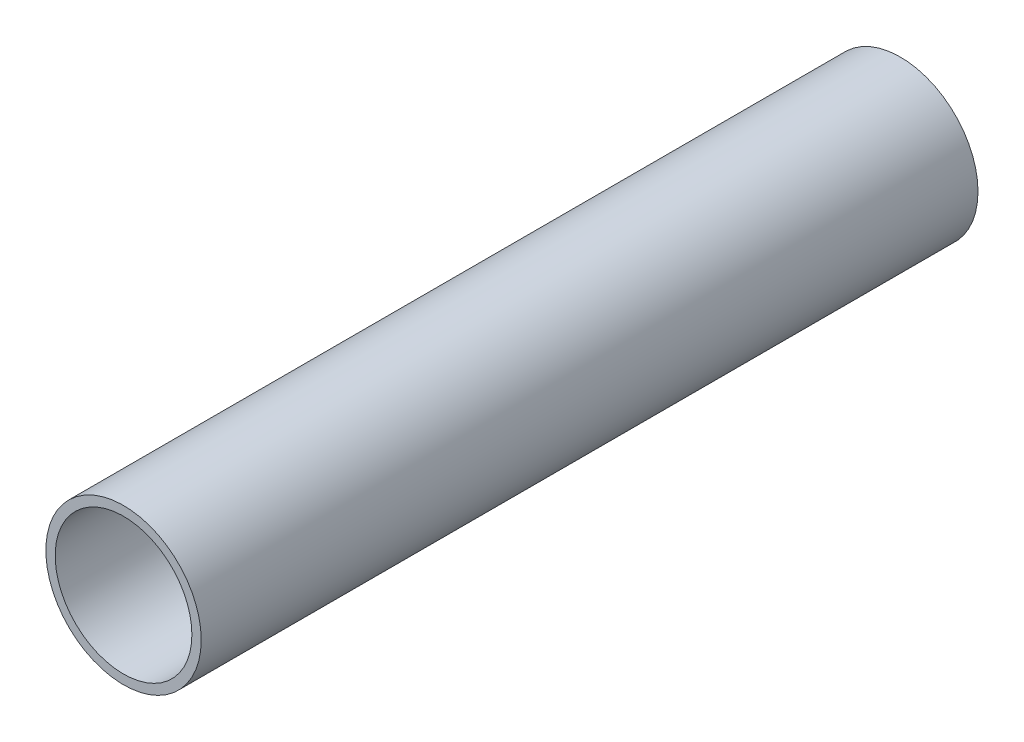
ISO-10303-21;
HEADER;
FILE_DESCRIPTION(('STEP AP214'),'2;1');
FILE_NAME('part.step','',(''),(''),'','','');
FILE_SCHEMA(('AUTOMOTIVE_DESIGN { 1 0 10303 214 1 1 1 1 }'));
ENDSEC;
DATA;
#1=APPLICATION_CONTEXT('core data for automotive mechanical design processes');
#2=APPLICATION_PROTOCOL_DEFINITION('international standard','automotive_design',2000,#1);
#3=PRODUCT_CONTEXT('',#1,'mechanical');
#4=PRODUCT('Part','Part','',(#3));
#5=PRODUCT_RELATED_PRODUCT_CATEGORY('part','',(#4));
#6=PRODUCT_DEFINITION_FORMATION('','',#4);
#7=PRODUCT_DEFINITION_CONTEXT('part definition',#1,'design');
#8=PRODUCT_DEFINITION('design','',#6,#7);
#9=PRODUCT_DEFINITION_SHAPE('','',#8);
#10=(LENGTH_UNIT() NAMED_UNIT(*) SI_UNIT(.MILLI.,.METRE.));
#11=(NAMED_UNIT(*) PLANE_ANGLE_UNIT() SI_UNIT($,.RADIAN.));
#12=(NAMED_UNIT(*) SI_UNIT($,.STERADIAN.) SOLID_ANGLE_UNIT());
#13=UNCERTAINTY_MEASURE_WITH_UNIT(LENGTH_MEASURE(1.E-05),#10,'distance_accuracy_value','');
#14=(GEOMETRIC_REPRESENTATION_CONTEXT(3) GLOBAL_UNCERTAINTY_ASSIGNED_CONTEXT((#13)) GLOBAL_UNIT_ASSIGNED_CONTEXT((#10,
#11,#12)) REPRESENTATION_CONTEXT('',''));
#15=CARTESIAN_POINT('',(0.,0.,0.));
#16=DIRECTION('',(0.,0.,1.));
#17=DIRECTION('',(1.,0.,0.));
#18=AXIS2_PLACEMENT_3D('',#15,#16,#17);
#19=CARTESIAN_POINT('',(0.,0.,25.));
#20=DIRECTION('',(0.,0.,1.));
#21=DIRECTION('',(1.,0.,0.));
#22=AXIS2_PLACEMENT_3D('',#19,#20,#21);
#23=PLANE('',#22);
#24=CARTESIAN_POINT('',(0.,0.,25.));
#25=DIRECTION('',(0.,0.,1.));
#26=DIRECTION('',(1.,0.,0.));
#27=AXIS2_PLACEMENT_3D('',#24,#25,#26);
#28=CIRCLE('',#27,2.5);
#29=CARTESIAN_POINT('',(2.5,0.,25.));
#30=VERTEX_POINT('',#29);
#31=EDGE_CURVE('E10',#30,#30,#28,.T.);
#32=ORIENTED_EDGE('',*,*,#31,.T.);
#33=EDGE_LOOP('',(#32));
#34=FACE_BOUND('',#33,.T.);
#35=CARTESIAN_POINT('',(0.,0.,25.));
#36=DIRECTION('',(0.,0.,1.));
#37=DIRECTION('',(1.,0.,0.));
#38=AXIS2_PLACEMENT_3D('',#35,#36,#37);
#39=CIRCLE('',#38,2.2);
#40=CARTESIAN_POINT('',(2.2,0.,25.));
#41=VERTEX_POINT('',#40);
#42=EDGE_CURVE('E42',#41,#41,#39,.T.);
#43=ORIENTED_EDGE('',*,*,#42,.F.);
#44=EDGE_LOOP('',(#43));
#45=FACE_BOUND('',#44,.T.);
#46=ADVANCED_FACE('F31',(#34,#45),#23,.T.);
#47=CARTESIAN_POINT('',(0.,0.,0.));
#48=DIRECTION('',(0.,0.,1.));
#49=DIRECTION('',(1.,0.,0.));
#50=AXIS2_PLACEMENT_3D('',#47,#48,#49);
#51=PLANE('',#50);
#52=CARTESIAN_POINT('',(0.,0.,0.));
#53=DIRECTION('',(0.,0.,1.));
#54=DIRECTION('',(1.,0.,0.));
#55=AXIS2_PLACEMENT_3D('',#52,#53,#54);
#56=CIRCLE('',#55,2.5);
#57=CARTESIAN_POINT('',(2.5,0.,0.));
#58=VERTEX_POINT('',#57);
#59=EDGE_CURVE('E35',#58,#58,#56,.T.);
#60=ORIENTED_EDGE('',*,*,#59,.F.);
#61=EDGE_LOOP('',(#60));
#62=FACE_BOUND('',#61,.T.);
#63=CARTESIAN_POINT('',(0.,0.,0.));
#64=DIRECTION('',(0.,0.,1.));
#65=DIRECTION('',(1.,0.,0.));
#66=AXIS2_PLACEMENT_3D('',#63,#64,#65);
#67=CIRCLE('',#66,2.2);
#68=CARTESIAN_POINT('',(2.2,0.,0.));
#69=VERTEX_POINT('',#68);
#70=EDGE_CURVE('E44',#69,#69,#67,.T.);
#71=ORIENTED_EDGE('',*,*,#70,.T.);
#72=EDGE_LOOP('',(#71));
#73=FACE_BOUND('',#72,.T.);
#74=ADVANCED_FACE('F54',(#62,#73),#51,.F.);
#75=CARTESIAN_POINT('',(0.,0.,25.));
#76=DIRECTION('',(0.,0.,-1.));
#77=DIRECTION('',(-1.,0.,0.));
#78=AXIS2_PLACEMENT_3D('',#75,#76,#77);
#79=CYLINDRICAL_SURFACE('',#78,2.5);
#80=ORIENTED_EDGE('',*,*,#31,.F.);
#81=EDGE_LOOP('',(#80));
#82=FACE_BOUND('',#81,.T.);
#83=ORIENTED_EDGE('',*,*,#59,.T.);
#84=EDGE_LOOP('',(#83));
#85=FACE_BOUND('',#84,.T.);
#86=ADVANCED_FACE('F33',(#82,#85),#79,.T.);
#87=CARTESIAN_POINT('',(0.,0.,25.));
#88=DIRECTION('',(0.,0.,-1.));
#89=DIRECTION('',(-1.,0.,0.));
#90=AXIS2_PLACEMENT_3D('',#87,#88,#89);
#91=CYLINDRICAL_SURFACE('',#90,2.2);
#92=ORIENTED_EDGE('',*,*,#42,.T.);
#93=EDGE_LOOP('',(#92));
#94=FACE_BOUND('',#93,.T.);
#95=ORIENTED_EDGE('',*,*,#70,.F.);
#96=EDGE_LOOP('',(#95));
#97=FACE_BOUND('',#96,.T.);
#98=ADVANCED_FACE('F50',(#94,#97),#91,.F.);
#99=CLOSED_SHELL('',(#46,#74,#86,#98));
#100=MANIFOLD_SOLID_BREP('B2',#99);
#101=ADVANCED_BREP_SHAPE_REPRESENTATION('',(#18,#100),#14);
#102=SHAPE_DEFINITION_REPRESENTATION(#9,#101);
ENDSEC;
END-ISO-10303-21;
